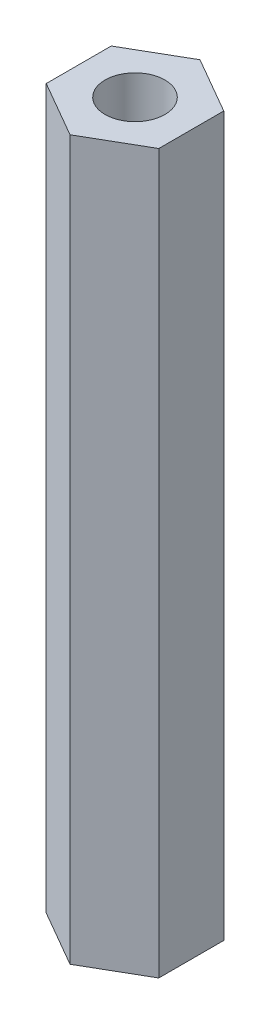
ISO-10303-21;
HEADER;
FILE_DESCRIPTION(('STEP AP214'),'2;1');
FILE_NAME('part.step','',(''),(''),'','','');
FILE_SCHEMA(('AUTOMOTIVE_DESIGN { 1 0 10303 214 1 1 1 1 }'));
ENDSEC;
DATA;
#1=APPLICATION_CONTEXT('core data for automotive mechanical design processes');
#2=APPLICATION_PROTOCOL_DEFINITION('international standard','automotive_design',2000,#1);
#3=PRODUCT_CONTEXT('',#1,'mechanical');
#4=PRODUCT('Part','Part','',(#3));
#5=PRODUCT_RELATED_PRODUCT_CATEGORY('part','',(#4));
#6=PRODUCT_DEFINITION_FORMATION('','',#4);
#7=PRODUCT_DEFINITION_CONTEXT('part definition',#1,'design');
#8=PRODUCT_DEFINITION('design','',#6,#7);
#9=PRODUCT_DEFINITION_SHAPE('','',#8);
#10=(LENGTH_UNIT() NAMED_UNIT(*) SI_UNIT(.MILLI.,.METRE.));
#11=(NAMED_UNIT(*) PLANE_ANGLE_UNIT() SI_UNIT($,.RADIAN.));
#12=(NAMED_UNIT(*) SI_UNIT($,.STERADIAN.) SOLID_ANGLE_UNIT());
#13=UNCERTAINTY_MEASURE_WITH_UNIT(LENGTH_MEASURE(1.E-05),#10,'distance_accuracy_value','');
#14=(GEOMETRIC_REPRESENTATION_CONTEXT(3) GLOBAL_UNCERTAINTY_ASSIGNED_CONTEXT((#13)) GLOBAL_UNIT_ASSIGNED_CONTEXT((#10,
#11,#12)) REPRESENTATION_CONTEXT('',''));
#15=CARTESIAN_POINT('',(0.,0.,0.));
#16=DIRECTION('',(0.,0.,1.));
#17=DIRECTION('',(1.,0.,0.));
#18=AXIS2_PLACEMENT_3D('',#15,#16,#17);
#19=CARTESIAN_POINT('',(0.,0.,0.));
#20=DIRECTION('',(0.,1.,0.));
#21=DIRECTION('',(0.,0.,1.));
#22=AXIS2_PLACEMENT_3D('',#19,#20,#21);
#23=CYLINDRICAL_SURFACE('',#22,1.25);
#24=CARTESIAN_POINT('',(0.,36.,0.));
#25=DIRECTION('',(0.,1.,0.));
#26=DIRECTION('',(0.,0.,1.));
#27=AXIS2_PLACEMENT_3D('',#24,#25,#26);
#28=CIRCLE('',#27,1.25);
#29=CARTESIAN_POINT('',(0.,36.,1.25));
#30=VERTEX_POINT('',#29);
#31=EDGE_CURVE('E131',#30,#30,#28,.T.);
#32=ORIENTED_EDGE('',*,*,#31,.T.);
#33=EDGE_LOOP('',(#32));
#34=FACE_BOUND('',#33,.T.);
#35=CARTESIAN_POINT('',(0.,6.,0.));
#36=DIRECTION('',(0.,-1.,0.));
#37=DIRECTION('',(0.,0.,-1.));
#38=AXIS2_PLACEMENT_3D('',#35,#36,#37);
#39=CIRCLE('',#38,1.25);
#40=CARTESIAN_POINT('',(0.,6.,-1.25));
#41=VERTEX_POINT('',#40);
#42=EDGE_CURVE('E45',#41,#41,#39,.F.);
#43=ORIENTED_EDGE('',*,*,#42,.F.);
#44=EDGE_LOOP('',(#43));
#45=FACE_BOUND('',#44,.T.);
#46=ADVANCED_FACE('F41',(#34,#45),#23,.F.);
#47=CARTESIAN_POINT('',(0.,36.,-2.71354626519124));
#48=DIRECTION('',(0.5,0.,0.866025403784438));
#49=DIRECTION('',(0.866025403784438,0.,-0.5));
#50=AXIS2_PLACEMENT_3D('',#47,#48,#49);
#51=PLANE('',#50);
#52=DIRECTION('',(-0.866025403784438,0.,0.5));
#53=VECTOR('',#52,1.);
#54=CARTESIAN_POINT('',(0.,6.,-2.71354626519124));
#55=LINE('',#54,#53);
#56=CARTESIAN_POINT('',(0.,6.,-2.71354626519124));
#57=VERTEX_POINT('',#56);
#58=CARTESIAN_POINT('',(-2.35,6.,-1.35677313259562));
#59=VERTEX_POINT('',#58);
#60=EDGE_CURVE('E127',#57,#59,#55,.T.);
#61=ORIENTED_EDGE('',*,*,#60,.T.);
#62=DIRECTION('',(0.,-1.,0.));
#63=VECTOR('',#62,1.);
#64=CARTESIAN_POINT('',(-2.35,36.,-1.35677313259562));
#65=LINE('',#64,#63);
#66=CARTESIAN_POINT('',(-2.35,36.,-1.35677313259562));
#67=VERTEX_POINT('',#66);
#68=EDGE_CURVE('E11',#67,#59,#65,.T.);
#69=ORIENTED_EDGE('',*,*,#68,.F.);
#70=DIRECTION('',(-0.866025403784438,0.,0.5));
#71=VECTOR('',#70,1.);
#72=CARTESIAN_POINT('',(0.,36.,-2.71354626519124));
#73=LINE('',#72,#71);
#74=CARTESIAN_POINT('',(0.,36.,-2.71354626519124));
#75=VERTEX_POINT('',#74);
#76=EDGE_CURVE('E138',#75,#67,#73,.T.);
#77=ORIENTED_EDGE('',*,*,#76,.F.);
#78=DIRECTION('',(0.,-1.,0.));
#79=VECTOR('',#78,1.);
#80=CARTESIAN_POINT('',(0.,36.,-2.71354626519124));
#81=LINE('',#80,#79);
#82=EDGE_CURVE('E123',#75,#57,#81,.T.);
#83=ORIENTED_EDGE('',*,*,#82,.T.);
#84=EDGE_LOOP('',(#61,#69,#77,#83));
#85=FACE_BOUND('',#84,.T.);
#86=ADVANCED_FACE('F43',(#85),#51,.F.);
#87=CARTESIAN_POINT('',(-2.35,36.,-1.35677313259562));
#88=DIRECTION('',(1.,0.,0.));
#89=DIRECTION('',(0.,0.,-1.));
#90=AXIS2_PLACEMENT_3D('',#87,#88,#89);
#91=PLANE('',#90);
#92=DIRECTION('',(0.,0.,1.));
#93=VECTOR('',#92,1.);
#94=CARTESIAN_POINT('',(-2.35,6.,-1.35677313259562));
#95=LINE('',#94,#93);
#96=CARTESIAN_POINT('',(-2.35,6.,1.35677313259562));
#97=VERTEX_POINT('',#96);
#98=EDGE_CURVE('E130',#59,#97,#95,.T.);
#99=ORIENTED_EDGE('',*,*,#98,.T.);
#100=DIRECTION('',(0.,-1.,0.));
#101=VECTOR('',#100,1.);
#102=CARTESIAN_POINT('',(-2.35,36.,1.35677313259562));
#103=LINE('',#102,#101);
#104=CARTESIAN_POINT('',(-2.35,36.,1.35677313259562));
#105=VERTEX_POINT('',#104);
#106=EDGE_CURVE('E51',#105,#97,#103,.T.);
#107=ORIENTED_EDGE('',*,*,#106,.F.);
#108=DIRECTION('',(0.,0.,1.));
#109=VECTOR('',#108,1.);
#110=CARTESIAN_POINT('',(-2.35,36.,-1.35677313259562));
#111=LINE('',#110,#109);
#112=EDGE_CURVE('E96',#67,#105,#111,.T.);
#113=ORIENTED_EDGE('',*,*,#112,.F.);
#114=ORIENTED_EDGE('',*,*,#68,.T.);
#115=EDGE_LOOP('',(#99,#107,#113,#114));
#116=FACE_BOUND('',#115,.T.);
#117=ADVANCED_FACE('F170',(#116),#91,.F.);
#118=CARTESIAN_POINT('',(-2.35,36.,1.35677313259562));
#119=DIRECTION('',(0.5,0.,-0.866025403784439));
#120=DIRECTION('',(-0.866025403784439,0.,-0.5));
#121=AXIS2_PLACEMENT_3D('',#118,#119,#120);
#122=PLANE('',#121);
#123=DIRECTION('',(0.866025403784439,0.,0.5));
#124=VECTOR('',#123,1.);
#125=CARTESIAN_POINT('',(-2.35,6.,1.35677313259562));
#126=LINE('',#125,#124);
#127=CARTESIAN_POINT('',(0.,6.,2.71354626519124));
#128=VERTEX_POINT('',#127);
#129=EDGE_CURVE('E133',#97,#128,#126,.T.);
#130=ORIENTED_EDGE('',*,*,#129,.T.);
#131=DIRECTION('',(0.,-1.,0.));
#132=VECTOR('',#131,1.);
#133=CARTESIAN_POINT('',(0.,36.,2.71354626519124));
#134=LINE('',#133,#132);
#135=CARTESIAN_POINT('',(0.,36.,2.71354626519124));
#136=VERTEX_POINT('',#135);
#137=EDGE_CURVE('E118',#136,#128,#134,.T.);
#138=ORIENTED_EDGE('',*,*,#137,.F.);
#139=DIRECTION('',(0.866025403784439,0.,0.5));
#140=VECTOR('',#139,1.);
#141=CARTESIAN_POINT('',(-2.35,36.,1.35677313259562));
#142=LINE('',#141,#140);
#143=EDGE_CURVE('E109',#105,#136,#142,.T.);
#144=ORIENTED_EDGE('',*,*,#143,.F.);
#145=ORIENTED_EDGE('',*,*,#106,.T.);
#146=EDGE_LOOP('',(#130,#138,#144,#145));
#147=FACE_BOUND('',#146,.T.);
#148=ADVANCED_FACE('F145',(#147),#122,.F.);
#149=CARTESIAN_POINT('',(0.,36.,2.71354626519124));
#150=DIRECTION('',(-0.5,0.,-0.866025403784439));
#151=DIRECTION('',(-0.866025403784439,0.,0.5));
#152=AXIS2_PLACEMENT_3D('',#149,#150,#151);
#153=PLANE('',#152);
#154=DIRECTION('',(0.866025403784439,0.,-0.5));
#155=VECTOR('',#154,1.);
#156=CARTESIAN_POINT('',(0.,6.,2.71354626519124));
#157=LINE('',#156,#155);
#158=CARTESIAN_POINT('',(2.35,6.,1.35677313259562));
#159=VERTEX_POINT('',#158);
#160=EDGE_CURVE('E117',#128,#159,#157,.T.);
#161=ORIENTED_EDGE('',*,*,#160,.T.);
#162=DIRECTION('',(0.,-1.,0.));
#163=VECTOR('',#162,1.);
#164=CARTESIAN_POINT('',(2.35,36.,1.35677313259562));
#165=LINE('',#164,#163);
#166=CARTESIAN_POINT('',(2.35,36.,1.35677313259562));
#167=VERTEX_POINT('',#166);
#168=EDGE_CURVE('E114',#167,#159,#165,.T.);
#169=ORIENTED_EDGE('',*,*,#168,.F.);
#170=DIRECTION('',(0.866025403784439,0.,-0.5));
#171=VECTOR('',#170,1.);
#172=CARTESIAN_POINT('',(0.,36.,2.71354626519124));
#173=LINE('',#172,#171);
#174=EDGE_CURVE('E103',#136,#167,#173,.T.);
#175=ORIENTED_EDGE('',*,*,#174,.F.);
#176=ORIENTED_EDGE('',*,*,#137,.T.);
#177=EDGE_LOOP('',(#161,#169,#175,#176));
#178=FACE_BOUND('',#177,.T.);
#179=ADVANCED_FACE('F115',(#178),#153,.F.);
#180=CARTESIAN_POINT('',(2.35,36.,1.35677313259562));
#181=DIRECTION('',(-1.,0.,0.));
#182=DIRECTION('',(0.,0.,1.));
#183=AXIS2_PLACEMENT_3D('',#180,#181,#182);
#184=PLANE('',#183);
#185=DIRECTION('',(0.,0.,-1.));
#186=VECTOR('',#185,1.);
#187=CARTESIAN_POINT('',(2.35,6.,1.35677313259562));
#188=LINE('',#187,#186);
#189=CARTESIAN_POINT('',(2.35,6.,-1.35677313259562));
#190=VERTEX_POINT('',#189);
#191=EDGE_CURVE('E82',#159,#190,#188,.T.);
#192=ORIENTED_EDGE('',*,*,#191,.T.);
#193=DIRECTION('',(0.,-1.,0.));
#194=VECTOR('',#193,1.);
#195=CARTESIAN_POINT('',(2.35,36.,-1.35677313259562));
#196=LINE('',#195,#194);
#197=CARTESIAN_POINT('',(2.35,36.,-1.35677313259562));
#198=VERTEX_POINT('',#197);
#199=EDGE_CURVE('E119',#198,#190,#196,.T.);
#200=ORIENTED_EDGE('',*,*,#199,.F.);
#201=DIRECTION('',(0.,0.,-1.));
#202=VECTOR('',#201,1.);
#203=CARTESIAN_POINT('',(2.35,36.,1.35677313259562));
#204=LINE('',#203,#202);
#205=EDGE_CURVE('E107',#167,#198,#204,.T.);
#206=ORIENTED_EDGE('',*,*,#205,.F.);
#207=ORIENTED_EDGE('',*,*,#168,.T.);
#208=EDGE_LOOP('',(#192,#200,#206,#207));
#209=FACE_BOUND('',#208,.T.);
#210=ADVANCED_FACE('F121',(#209),#184,.F.);
#211=CARTESIAN_POINT('',(2.35,36.,-1.35677313259562));
#212=DIRECTION('',(-0.5,0.,0.866025403784438));
#213=DIRECTION('',(0.866025403784439,0.,0.5));
#214=AXIS2_PLACEMENT_3D('',#211,#212,#213);
#215=PLANE('',#214);
#216=DIRECTION('',(-0.866025403784439,0.,-0.5));
#217=VECTOR('',#216,1.);
#218=CARTESIAN_POINT('',(2.35,6.,-1.35677313259562));
#219=LINE('',#218,#217);
#220=EDGE_CURVE('E88',#190,#57,#219,.T.);
#221=ORIENTED_EDGE('',*,*,#220,.T.);
#222=ORIENTED_EDGE('',*,*,#82,.F.);
#223=DIRECTION('',(-0.866025403784439,0.,-0.5));
#224=VECTOR('',#223,1.);
#225=CARTESIAN_POINT('',(2.35,36.,-1.35677313259562));
#226=LINE('',#225,#224);
#227=EDGE_CURVE('E59',#198,#75,#226,.T.);
#228=ORIENTED_EDGE('',*,*,#227,.F.);
#229=ORIENTED_EDGE('',*,*,#199,.T.);
#230=EDGE_LOOP('',(#221,#222,#228,#229));
#231=FACE_BOUND('',#230,.T.);
#232=ADVANCED_FACE('F153',(#231),#215,.F.);
#233=CARTESIAN_POINT('',(0.,36.,0.));
#234=DIRECTION('',(0.,1.,0.));
#235=DIRECTION('',(0.,0.,1.));
#236=AXIS2_PLACEMENT_3D('',#233,#234,#235);
#237=PLANE('',#236);
#238=ORIENTED_EDGE('',*,*,#31,.F.);
#239=EDGE_LOOP('',(#238));
#240=FACE_BOUND('',#239,.T.);
#241=ORIENTED_EDGE('',*,*,#76,.T.);
#242=ORIENTED_EDGE('',*,*,#112,.T.);
#243=ORIENTED_EDGE('',*,*,#143,.T.);
#244=ORIENTED_EDGE('',*,*,#174,.T.);
#245=ORIENTED_EDGE('',*,*,#205,.T.);
#246=ORIENTED_EDGE('',*,*,#227,.T.);
#247=EDGE_LOOP('',(#241,#242,#243,#244,#245,#246));
#248=FACE_BOUND('',#247,.T.);
#249=ADVANCED_FACE('F105',(#240,#248),#237,.T.);
#250=CARTESIAN_POINT('',(0.,6.,0.));
#251=DIRECTION('',(0.,1.,0.));
#252=DIRECTION('',(0.,0.,1.));
#253=AXIS2_PLACEMENT_3D('',#250,#251,#252);
#254=PLANE('',#253);
#255=ORIENTED_EDGE('',*,*,#60,.F.);
#256=ORIENTED_EDGE('',*,*,#220,.F.);
#257=ORIENTED_EDGE('',*,*,#191,.F.);
#258=ORIENTED_EDGE('',*,*,#160,.F.);
#259=ORIENTED_EDGE('',*,*,#129,.F.);
#260=ORIENTED_EDGE('',*,*,#98,.F.);
#261=EDGE_LOOP('',(#255,#256,#257,#258,#259,#260));
#262=FACE_BOUND('',#261,.T.);
#263=ORIENTED_EDGE('',*,*,#42,.T.);
#264=EDGE_LOOP('',(#263));
#265=FACE_BOUND('',#264,.T.);
#266=ADVANCED_FACE('F148',(#262,#265),#254,.F.);
#267=CLOSED_SHELL('',(#46,#86,#117,#148,#179,#210,#232,#249,#266));
#268=MANIFOLD_SOLID_BREP('B2',#267);
#269=ADVANCED_BREP_SHAPE_REPRESENTATION('',(#18,#268),#14);
#270=SHAPE_DEFINITION_REPRESENTATION(#9,#269);
ENDSEC;
END-ISO-10303-21;
